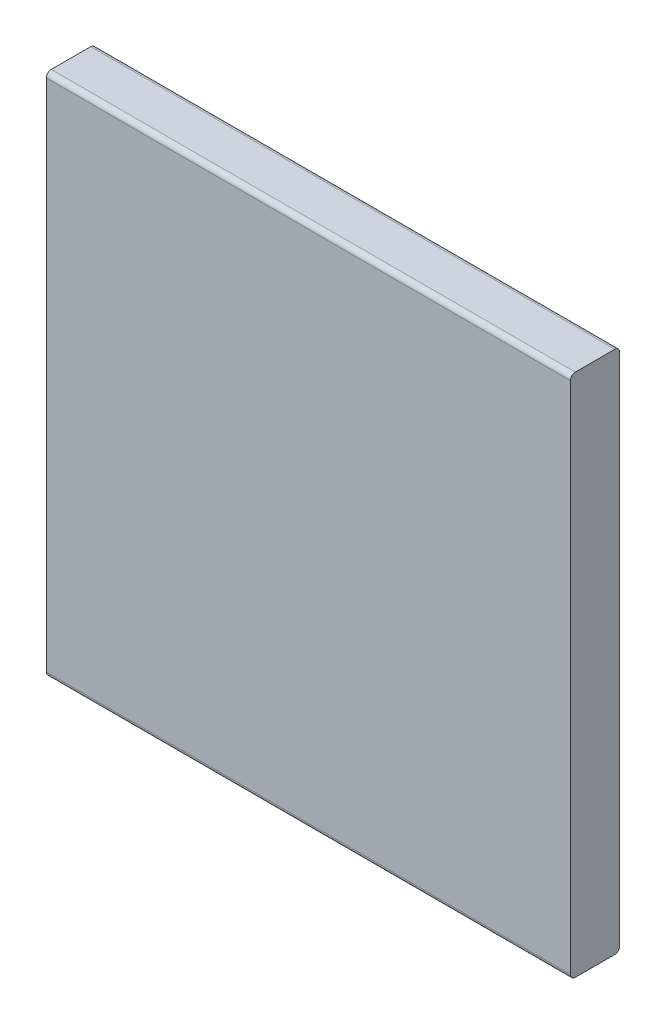
ISO-10303-21;
HEADER;
FILE_DESCRIPTION(('STEP AP214'),'2;1');
FILE_NAME('part.step','',(''),(''),'','','');
FILE_SCHEMA(('AUTOMOTIVE_DESIGN { 1 0 10303 214 1 1 1 1 }'));
ENDSEC;
DATA;
#1=APPLICATION_CONTEXT('core data for automotive mechanical design processes');
#2=APPLICATION_PROTOCOL_DEFINITION('international standard','automotive_design',2000,#1);
#3=PRODUCT_CONTEXT('',#1,'mechanical');
#4=PRODUCT('Part','Part','',(#3));
#5=PRODUCT_RELATED_PRODUCT_CATEGORY('part','',(#4));
#6=PRODUCT_DEFINITION_FORMATION('','',#4);
#7=PRODUCT_DEFINITION_CONTEXT('part definition',#1,'design');
#8=PRODUCT_DEFINITION('design','',#6,#7);
#9=PRODUCT_DEFINITION_SHAPE('','',#8);
#10=(LENGTH_UNIT() NAMED_UNIT(*) SI_UNIT(.MILLI.,.METRE.));
#11=(NAMED_UNIT(*) PLANE_ANGLE_UNIT() SI_UNIT($,.RADIAN.));
#12=(NAMED_UNIT(*) SI_UNIT($,.STERADIAN.) SOLID_ANGLE_UNIT());
#13=UNCERTAINTY_MEASURE_WITH_UNIT(LENGTH_MEASURE(1.E-05),#10,'distance_accuracy_value','');
#14=(GEOMETRIC_REPRESENTATION_CONTEXT(3) GLOBAL_UNCERTAINTY_ASSIGNED_CONTEXT((#13)) GLOBAL_UNIT_ASSIGNED_CONTEXT((#10,
#11,#12)) REPRESENTATION_CONTEXT('',''));
#15=CARTESIAN_POINT('',(0.,0.,0.));
#16=DIRECTION('',(0.,0.,1.));
#17=DIRECTION('',(1.,0.,0.));
#18=AXIS2_PLACEMENT_3D('',#15,#16,#17);
#19=CARTESIAN_POINT('',(-25.4,25.4,-2.3876));
#20=DIRECTION('',(-1.,0.,0.));
#21=DIRECTION('',(0.,-1.,0.));
#22=AXIS2_PLACEMENT_3D('',#19,#20,#21);
#23=PLANE('',#22);
#24=DIRECTION('',(0.,0.,1.));
#25=VECTOR('',#24,1.);
#26=CARTESIAN_POINT('',(-25.4,-25.4,-2.3876));
#27=LINE('',#26,#25);
#28=CARTESIAN_POINT('',(-25.4,-25.4,-1.91008));
#29=VERTEX_POINT('',#28);
#30=CARTESIAN_POINT('',(-25.4,-25.4,1.91008));
#31=VERTEX_POINT('',#30);
#32=EDGE_CURVE('E152',#29,#31,#27,.T.);
#33=ORIENTED_EDGE('',*,*,#32,.T.);
#34=CARTESIAN_POINT('',(-25.4,-24.92248,1.91008));
#35=DIRECTION('',(-1.,0.,0.));
#36=DIRECTION('',(0.,-1.,0.));
#37=AXIS2_PLACEMENT_3D('',#34,#35,#36);
#38=CIRCLE('',#37,0.47752);
#39=CARTESIAN_POINT('',(-25.4,-24.92248,2.3876));
#40=VERTEX_POINT('',#39);
#41=EDGE_CURVE('E138',#31,#40,#38,.T.);
#42=ORIENTED_EDGE('',*,*,#41,.T.);
#43=DIRECTION('',(0.,-1.,0.));
#44=VECTOR('',#43,1.);
#45=CARTESIAN_POINT('',(-25.4,25.4,2.3876));
#46=LINE('',#45,#44);
#47=CARTESIAN_POINT('',(-25.4,24.92248,2.3876));
#48=VERTEX_POINT('',#47);
#49=EDGE_CURVE('E128',#48,#40,#46,.T.);
#50=ORIENTED_EDGE('',*,*,#49,.F.);
#51=CARTESIAN_POINT('',(-25.4,24.92248,1.91008));
#52=DIRECTION('',(-1.,0.,0.));
#53=DIRECTION('',(0.,-1.,0.));
#54=AXIS2_PLACEMENT_3D('',#51,#52,#53);
#55=CIRCLE('',#54,0.47752);
#56=CARTESIAN_POINT('',(-25.4,25.4,1.91008));
#57=VERTEX_POINT('',#56);
#58=EDGE_CURVE('E113',#48,#57,#55,.T.);
#59=ORIENTED_EDGE('',*,*,#58,.T.);
#60=DIRECTION('',(0.,0.,1.));
#61=VECTOR('',#60,1.);
#62=CARTESIAN_POINT('',(-25.4,25.4,-2.3876));
#63=LINE('',#62,#61);
#64=CARTESIAN_POINT('',(-25.4,25.4,-1.91008));
#65=VERTEX_POINT('',#64);
#66=EDGE_CURVE('E134',#65,#57,#63,.T.);
#67=ORIENTED_EDGE('',*,*,#66,.F.);
#68=CARTESIAN_POINT('',(-25.4,24.92248,-1.91008));
#69=DIRECTION('',(-1.,0.,0.));
#70=DIRECTION('',(0.,-1.,0.));
#71=AXIS2_PLACEMENT_3D('',#68,#69,#70);
#72=CIRCLE('',#71,0.47752);
#73=CARTESIAN_POINT('',(-25.4,24.92248,-2.3876));
#74=VERTEX_POINT('',#73);
#75=EDGE_CURVE('E70',#65,#74,#72,.T.);
#76=ORIENTED_EDGE('',*,*,#75,.T.);
#77=DIRECTION('',(0.,-1.,0.));
#78=VECTOR('',#77,1.);
#79=CARTESIAN_POINT('',(-25.4,25.4,-2.3876));
#80=LINE('',#79,#78);
#81=CARTESIAN_POINT('',(-25.4,-24.92248,-2.3876));
#82=VERTEX_POINT('',#81);
#83=EDGE_CURVE('E143',#74,#82,#80,.T.);
#84=ORIENTED_EDGE('',*,*,#83,.T.);
#85=CARTESIAN_POINT('',(-25.4,-24.92248,-1.91008));
#86=DIRECTION('',(-1.,0.,0.));
#87=DIRECTION('',(0.,-1.,0.));
#88=AXIS2_PLACEMENT_3D('',#85,#86,#87);
#89=CIRCLE('',#88,0.47752);
#90=EDGE_CURVE('E121',#82,#29,#89,.T.);
#91=ORIENTED_EDGE('',*,*,#90,.T.);
#92=EDGE_LOOP('',(#33,#42,#50,#59,#67,#76,#84,#91));
#93=FACE_BOUND('',#92,.T.);
#94=ADVANCED_FACE('F47',(#93),#23,.T.);
#95=CARTESIAN_POINT('',(-25.4,25.4,-2.3876));
#96=DIRECTION('',(0.,1.,0.));
#97=DIRECTION('',(-1.,0.,0.));
#98=AXIS2_PLACEMENT_3D('',#95,#96,#97);
#99=PLANE('',#98);
#100=ORIENTED_EDGE('',*,*,#66,.T.);
#101=DIRECTION('',(-1.,0.,0.));
#102=VECTOR('',#101,1.);
#103=CARTESIAN_POINT('',(-25.4,25.4,1.91008));
#104=LINE('',#103,#102);
#105=CARTESIAN_POINT('',(25.4,25.4,1.91008));
#106=VERTEX_POINT('',#105);
#107=EDGE_CURVE('E11',#57,#106,#104,.F.);
#108=ORIENTED_EDGE('',*,*,#107,.T.);
#109=DIRECTION('',(0.,0.,1.));
#110=VECTOR('',#109,1.);
#111=CARTESIAN_POINT('',(25.4,25.4,-2.3876));
#112=LINE('',#111,#110);
#113=CARTESIAN_POINT('',(25.4,25.4,-1.91008));
#114=VERTEX_POINT('',#113);
#115=EDGE_CURVE('E155',#114,#106,#112,.T.);
#116=ORIENTED_EDGE('',*,*,#115,.F.);
#117=DIRECTION('',(-1.,0.,0.));
#118=VECTOR('',#117,1.);
#119=CARTESIAN_POINT('',(-25.4,25.4,-1.91008));
#120=LINE('',#119,#118);
#121=EDGE_CURVE('E56',#114,#65,#120,.T.);
#122=ORIENTED_EDGE('',*,*,#121,.T.);
#123=EDGE_LOOP('',(#100,#108,#116,#122));
#124=FACE_BOUND('',#123,.T.);
#125=ADVANCED_FACE('F202',(#124),#99,.T.);
#126=CARTESIAN_POINT('',(25.4,25.4,-2.3876));
#127=DIRECTION('',(1.,0.,0.));
#128=DIRECTION('',(0.,1.,0.));
#129=AXIS2_PLACEMENT_3D('',#126,#127,#128);
#130=PLANE('',#129);
#131=DIRECTION('',(0.,1.,0.));
#132=VECTOR('',#131,1.);
#133=CARTESIAN_POINT('',(25.4,25.4,2.3876));
#134=LINE('',#133,#132);
#135=CARTESIAN_POINT('',(25.4,-24.92248,2.3876));
#136=VERTEX_POINT('',#135);
#137=CARTESIAN_POINT('',(25.4,24.92248,2.3876));
#138=VERTEX_POINT('',#137);
#139=EDGE_CURVE('E131',#136,#138,#134,.T.);
#140=ORIENTED_EDGE('',*,*,#139,.F.);
#141=CARTESIAN_POINT('',(25.4,-24.92248,1.91008));
#142=DIRECTION('',(1.,0.,0.));
#143=DIRECTION('',(0.,1.,0.));
#144=AXIS2_PLACEMENT_3D('',#141,#142,#143);
#145=CIRCLE('',#144,0.47752);
#146=CARTESIAN_POINT('',(25.4,-25.4,1.91008));
#147=VERTEX_POINT('',#146);
#148=EDGE_CURVE('E176',#136,#147,#145,.T.);
#149=ORIENTED_EDGE('',*,*,#148,.T.);
#150=DIRECTION('',(0.,0.,1.));
#151=VECTOR('',#150,1.);
#152=CARTESIAN_POINT('',(25.4,-25.4,-2.3876));
#153=LINE('',#152,#151);
#154=CARTESIAN_POINT('',(25.4,-25.4,-1.91008));
#155=VERTEX_POINT('',#154);
#156=EDGE_CURVE('E159',#155,#147,#153,.T.);
#157=ORIENTED_EDGE('',*,*,#156,.F.);
#158=CARTESIAN_POINT('',(25.4,-24.92248,-1.91008));
#159=DIRECTION('',(1.,0.,0.));
#160=DIRECTION('',(0.,1.,0.));
#161=AXIS2_PLACEMENT_3D('',#158,#159,#160);
#162=CIRCLE('',#161,0.47752);
#163=CARTESIAN_POINT('',(25.4,-24.92248,-2.3876));
#164=VERTEX_POINT('',#163);
#165=EDGE_CURVE('E173',#155,#164,#162,.T.);
#166=ORIENTED_EDGE('',*,*,#165,.T.);
#167=DIRECTION('',(0.,1.,0.));
#168=VECTOR('',#167,1.);
#169=CARTESIAN_POINT('',(25.4,25.4,-2.3876));
#170=LINE('',#169,#168);
#171=CARTESIAN_POINT('',(25.4,24.92248,-2.3876));
#172=VERTEX_POINT('',#171);
#173=EDGE_CURVE('E148',#164,#172,#170,.T.);
#174=ORIENTED_EDGE('',*,*,#173,.T.);
#175=CARTESIAN_POINT('',(25.4,24.92248,-1.91008));
#176=DIRECTION('',(1.,0.,0.));
#177=DIRECTION('',(0.,1.,0.));
#178=AXIS2_PLACEMENT_3D('',#175,#176,#177);
#179=CIRCLE('',#178,0.47752);
#180=EDGE_CURVE('E167',#172,#114,#179,.T.);
#181=ORIENTED_EDGE('',*,*,#180,.T.);
#182=ORIENTED_EDGE('',*,*,#115,.T.);
#183=CARTESIAN_POINT('',(25.4,24.92248,1.91008));
#184=DIRECTION('',(1.,0.,0.));
#185=DIRECTION('',(0.,1.,0.));
#186=AXIS2_PLACEMENT_3D('',#183,#184,#185);
#187=CIRCLE('',#186,0.47752);
#188=EDGE_CURVE('E170',#106,#138,#187,.T.);
#189=ORIENTED_EDGE('',*,*,#188,.T.);
#190=EDGE_LOOP('',(#140,#149,#157,#166,#174,#181,#182,#189));
#191=FACE_BOUND('',#190,.T.);
#192=ADVANCED_FACE('F208',(#191),#130,.T.);
#193=CARTESIAN_POINT('',(-25.4,-25.4,-2.3876));
#194=DIRECTION('',(0.,-1.,0.));
#195=DIRECTION('',(1.,0.,0.));
#196=AXIS2_PLACEMENT_3D('',#193,#194,#195);
#197=PLANE('',#196);
#198=ORIENTED_EDGE('',*,*,#156,.T.);
#199=DIRECTION('',(1.,0.,0.));
#200=VECTOR('',#199,1.);
#201=CARTESIAN_POINT('',(-25.4,-25.4,1.91008));
#202=LINE('',#201,#200);
#203=EDGE_CURVE('E183',#147,#31,#202,.F.);
#204=ORIENTED_EDGE('',*,*,#203,.T.);
#205=ORIENTED_EDGE('',*,*,#32,.F.);
#206=DIRECTION('',(1.,0.,0.));
#207=VECTOR('',#206,1.);
#208=CARTESIAN_POINT('',(25.4,-25.4,-1.91008));
#209=LINE('',#208,#207);
#210=EDGE_CURVE('E179',#29,#155,#209,.T.);
#211=ORIENTED_EDGE('',*,*,#210,.T.);
#212=EDGE_LOOP('',(#198,#204,#205,#211));
#213=FACE_BOUND('',#212,.T.);
#214=ADVANCED_FACE('F216',(#213),#197,.T.);
#215=CARTESIAN_POINT('',(0.,0.,-2.3876));
#216=DIRECTION('',(0.,0.,1.));
#217=DIRECTION('',(1.,0.,0.));
#218=AXIS2_PLACEMENT_3D('',#215,#216,#217);
#219=PLANE('',#218);
#220=ORIENTED_EDGE('',*,*,#173,.F.);
#221=DIRECTION('',(1.,0.,0.));
#222=VECTOR('',#221,1.);
#223=CARTESIAN_POINT('',(-25.4,-24.92248,-2.3876));
#224=LINE('',#223,#222);
#225=EDGE_CURVE('E63',#164,#82,#224,.F.);
#226=ORIENTED_EDGE('',*,*,#225,.T.);
#227=ORIENTED_EDGE('',*,*,#83,.F.);
#228=DIRECTION('',(-1.,0.,0.));
#229=VECTOR('',#228,1.);
#230=CARTESIAN_POINT('',(25.4,24.92248,-2.3876));
#231=LINE('',#230,#229);
#232=EDGE_CURVE('E192',#74,#172,#231,.F.);
#233=ORIENTED_EDGE('',*,*,#232,.T.);
#234=EDGE_LOOP('',(#220,#226,#227,#233));
#235=FACE_BOUND('',#234,.T.);
#236=ADVANCED_FACE('F206',(#235),#219,.F.);
#237=CARTESIAN_POINT('',(0.,0.,2.3876));
#238=DIRECTION('',(0.,0.,1.));
#239=DIRECTION('',(1.,0.,0.));
#240=AXIS2_PLACEMENT_3D('',#237,#238,#239);
#241=PLANE('',#240);
#242=ORIENTED_EDGE('',*,*,#49,.T.);
#243=DIRECTION('',(1.,0.,0.));
#244=VECTOR('',#243,1.);
#245=CARTESIAN_POINT('',(0.,-24.92248,2.3876));
#246=LINE('',#245,#244);
#247=EDGE_CURVE('E133',#40,#136,#246,.T.);
#248=ORIENTED_EDGE('',*,*,#247,.T.);
#249=ORIENTED_EDGE('',*,*,#139,.T.);
#250=DIRECTION('',(-1.,0.,0.));
#251=VECTOR('',#250,1.);
#252=CARTESIAN_POINT('',(0.,24.92248,2.3876));
#253=LINE('',#252,#251);
#254=EDGE_CURVE('E117',#138,#48,#253,.T.);
#255=ORIENTED_EDGE('',*,*,#254,.T.);
#256=EDGE_LOOP('',(#242,#248,#249,#255));
#257=FACE_BOUND('',#256,.T.);
#258=ADVANCED_FACE('F126',(#257),#241,.T.);
#259=CARTESIAN_POINT('',(0.,-24.92248,1.91008));
#260=DIRECTION('',(1.,0.,0.));
#261=DIRECTION('',(0.,1.,0.));
#262=AXIS2_PLACEMENT_3D('',#259,#260,#261);
#263=CYLINDRICAL_SURFACE('',#262,0.47752);
#264=ORIENTED_EDGE('',*,*,#41,.F.);
#265=ORIENTED_EDGE('',*,*,#203,.F.);
#266=ORIENTED_EDGE('',*,*,#148,.F.);
#267=ORIENTED_EDGE('',*,*,#247,.F.);
#268=EDGE_LOOP('',(#264,#265,#266,#267));
#269=FACE_BOUND('',#268,.T.);
#270=ADVANCED_FACE('F219',(#269),#263,.T.);
#271=CARTESIAN_POINT('',(-25.4,-24.92248,-1.91008));
#272=DIRECTION('',(-1.,0.,0.));
#273=DIRECTION('',(0.,-1.,0.));
#274=AXIS2_PLACEMENT_3D('',#271,#272,#273);
#275=CYLINDRICAL_SURFACE('',#274,0.47752);
#276=ORIENTED_EDGE('',*,*,#90,.F.);
#277=ORIENTED_EDGE('',*,*,#225,.F.);
#278=ORIENTED_EDGE('',*,*,#165,.F.);
#279=ORIENTED_EDGE('',*,*,#210,.F.);
#280=EDGE_LOOP('',(#276,#277,#278,#279));
#281=FACE_BOUND('',#280,.T.);
#282=ADVANCED_FACE('F213',(#281),#275,.T.);
#283=CARTESIAN_POINT('',(0.,24.92248,1.91008));
#284=DIRECTION('',(-1.,0.,0.));
#285=DIRECTION('',(0.,-1.,0.));
#286=AXIS2_PLACEMENT_3D('',#283,#284,#285);
#287=CYLINDRICAL_SURFACE('',#286,0.47752);
#288=ORIENTED_EDGE('',*,*,#188,.F.);
#289=ORIENTED_EDGE('',*,*,#107,.F.);
#290=ORIENTED_EDGE('',*,*,#58,.F.);
#291=ORIENTED_EDGE('',*,*,#254,.F.);
#292=EDGE_LOOP('',(#288,#289,#290,#291));
#293=FACE_BOUND('',#292,.T.);
#294=ADVANCED_FACE('F116',(#293),#287,.T.);
#295=CARTESIAN_POINT('',(-25.4,24.92248,-1.91008));
#296=DIRECTION('',(1.,0.,0.));
#297=DIRECTION('',(0.,1.,0.));
#298=AXIS2_PLACEMENT_3D('',#295,#296,#297);
#299=CYLINDRICAL_SURFACE('',#298,0.47752);
#300=ORIENTED_EDGE('',*,*,#180,.F.);
#301=ORIENTED_EDGE('',*,*,#232,.F.);
#302=ORIENTED_EDGE('',*,*,#75,.F.);
#303=ORIENTED_EDGE('',*,*,#121,.F.);
#304=EDGE_LOOP('',(#300,#301,#302,#303));
#305=FACE_BOUND('',#304,.T.);
#306=ADVANCED_FACE('F49',(#305),#299,.T.);
#307=CLOSED_SHELL('',(#94,#125,#192,#214,#236,#258,#270,#282,#294,#306));
#308=MANIFOLD_SOLID_BREP('B2',#307);
#309=ADVANCED_BREP_SHAPE_REPRESENTATION('',(#18,#308),#14);
#310=SHAPE_DEFINITION_REPRESENTATION(#9,#309);
ENDSEC;
END-ISO-10303-21;
